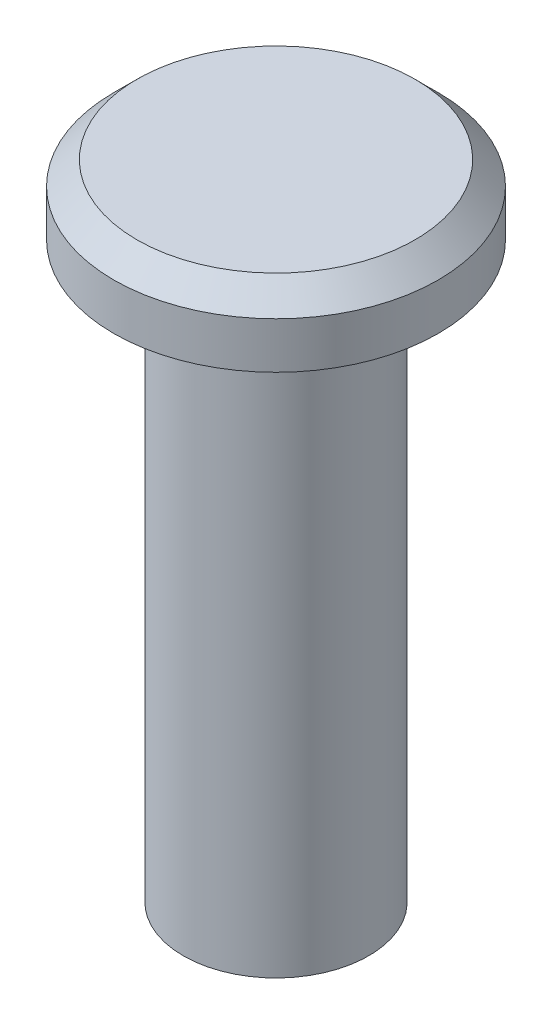
ISO-10303-21;
HEADER;
FILE_DESCRIPTION(('STEP AP214'),'2;1');
FILE_NAME('part.step','',(''),(''),'','','');
FILE_SCHEMA(('AUTOMOTIVE_DESIGN { 1 0 10303 214 1 1 1 1 }'));
ENDSEC;
DATA;
#1=APPLICATION_CONTEXT('core data for automotive mechanical design processes');
#2=APPLICATION_PROTOCOL_DEFINITION('international standard','automotive_design',2000,#1);
#3=PRODUCT_CONTEXT('',#1,'mechanical');
#4=PRODUCT('Part','Part','',(#3));
#5=PRODUCT_RELATED_PRODUCT_CATEGORY('part','',(#4));
#6=PRODUCT_DEFINITION_FORMATION('','',#4);
#7=PRODUCT_DEFINITION_CONTEXT('part definition',#1,'design');
#8=PRODUCT_DEFINITION('design','',#6,#7);
#9=PRODUCT_DEFINITION_SHAPE('','',#8);
#10=(LENGTH_UNIT() NAMED_UNIT(*) SI_UNIT(.MILLI.,.METRE.));
#11=(NAMED_UNIT(*) PLANE_ANGLE_UNIT() SI_UNIT($,.RADIAN.));
#12=(NAMED_UNIT(*) SI_UNIT($,.STERADIAN.) SOLID_ANGLE_UNIT());
#13=UNCERTAINTY_MEASURE_WITH_UNIT(LENGTH_MEASURE(1.E-05),#10,'distance_accuracy_value','');
#14=(GEOMETRIC_REPRESENTATION_CONTEXT(3) GLOBAL_UNCERTAINTY_ASSIGNED_CONTEXT((#13)) GLOBAL_UNIT_ASSIGNED_CONTEXT((#10,
#11,#12)) REPRESENTATION_CONTEXT('',''));
#15=CARTESIAN_POINT('',(0.,0.,0.));
#16=DIRECTION('',(0.,0.,1.));
#17=DIRECTION('',(1.,0.,0.));
#18=AXIS2_PLACEMENT_3D('',#15,#16,#17);
#19=CARTESIAN_POINT('',(0.,3.,0.));
#20=DIRECTION('',(0.,-1.,0.));
#21=DIRECTION('',(0.,0.,-1.));
#22=AXIS2_PLACEMENT_3D('',#19,#20,#21);
#23=CYLINDRICAL_SURFACE('',#22,7.);
#24=CARTESIAN_POINT('',(0.,1.99999999999999,0.));
#25=DIRECTION('',(0.,1.,0.));
#26=DIRECTION('',(0.,0.,1.));
#27=AXIS2_PLACEMENT_3D('',#24,#25,#26);
#28=CIRCLE('',#27,7.);
#29=CARTESIAN_POINT('',(0.,1.99999999999999,7.));
#30=VERTEX_POINT('',#29);
#31=EDGE_CURVE('E10',#30,#30,#28,.F.);
#32=ORIENTED_EDGE('',*,*,#31,.T.);
#33=EDGE_LOOP('',(#32));
#34=FACE_BOUND('',#33,.T.);
#35=CARTESIAN_POINT('',(0.,0.,0.));
#36=DIRECTION('',(0.,1.,0.));
#37=DIRECTION('',(0.,0.,1.));
#38=AXIS2_PLACEMENT_3D('',#35,#36,#37);
#39=CIRCLE('',#38,7.);
#40=CARTESIAN_POINT('',(0.,0.,7.));
#41=VERTEX_POINT('',#40);
#42=EDGE_CURVE('E64',#41,#41,#39,.T.);
#43=ORIENTED_EDGE('',*,*,#42,.T.);
#44=EDGE_LOOP('',(#43));
#45=FACE_BOUND('',#44,.T.);
#46=ADVANCED_FACE('F45',(#34,#45),#23,.T.);
#47=CARTESIAN_POINT('',(0.,3.,0.));
#48=DIRECTION('',(0.,1.,0.));
#49=DIRECTION('',(0.,0.,1.));
#50=AXIS2_PLACEMENT_3D('',#47,#48,#49);
#51=PLANE('',#50);
#52=CARTESIAN_POINT('',(0.,3.,0.));
#53=DIRECTION('',(0.,1.,0.));
#54=DIRECTION('',(0.,0.,1.));
#55=AXIS2_PLACEMENT_3D('',#52,#53,#54);
#56=CIRCLE('',#55,6.);
#57=CARTESIAN_POINT('',(0.,3.,6.));
#58=VERTEX_POINT('',#57);
#59=EDGE_CURVE('E54',#58,#58,#56,.T.);
#60=ORIENTED_EDGE('',*,*,#59,.T.);
#61=EDGE_LOOP('',(#60));
#62=FACE_BOUND('',#61,.T.);
#63=ADVANCED_FACE('F86',(#62),#51,.T.);
#64=CARTESIAN_POINT('',(0.,0.,0.));
#65=DIRECTION('',(0.,1.,0.));
#66=DIRECTION('',(0.,0.,1.));
#67=AXIS2_PLACEMENT_3D('',#64,#65,#66);
#68=PLANE('',#67);
#69=CARTESIAN_POINT('',(0.,0.,0.));
#70=DIRECTION('',(0.,-1.,0.));
#71=DIRECTION('',(0.,0.,-1.));
#72=AXIS2_PLACEMENT_3D('',#69,#70,#71);
#73=CIRCLE('',#72,4.);
#74=CARTESIAN_POINT('',(0.,0.,-4.));
#75=VERTEX_POINT('',#74);
#76=EDGE_CURVE('E59',#75,#75,#73,.T.);
#77=ORIENTED_EDGE('',*,*,#76,.F.);
#78=EDGE_LOOP('',(#77));
#79=FACE_BOUND('',#78,.T.);
#80=ORIENTED_EDGE('',*,*,#42,.F.);
#81=EDGE_LOOP('',(#80));
#82=FACE_BOUND('',#81,.T.);
#83=ADVANCED_FACE('F80',(#79,#82),#68,.F.);
#84=CARTESIAN_POINT('',(0.,-24.75,0.));
#85=DIRECTION('',(0.,1.,0.));
#86=DIRECTION('',(0.,0.,1.));
#87=AXIS2_PLACEMENT_3D('',#84,#85,#86);
#88=CYLINDRICAL_SURFACE('',#87,4.);
#89=CARTESIAN_POINT('',(0.,-24.75,0.));
#90=DIRECTION('',(0.,-1.,0.));
#91=DIRECTION('',(0.,0.,-1.));
#92=AXIS2_PLACEMENT_3D('',#89,#90,#91);
#93=CIRCLE('',#92,4.);
#94=CARTESIAN_POINT('',(0.,-24.75,-4.));
#95=VERTEX_POINT('',#94);
#96=EDGE_CURVE('E69',#95,#95,#93,.T.);
#97=ORIENTED_EDGE('',*,*,#96,.F.);
#98=EDGE_LOOP('',(#97));
#99=FACE_BOUND('',#98,.T.);
#100=ORIENTED_EDGE('',*,*,#76,.T.);
#101=EDGE_LOOP('',(#100));
#102=FACE_BOUND('',#101,.T.);
#103=ADVANCED_FACE('F77',(#99,#102),#88,.T.);
#104=CARTESIAN_POINT('',(0.,-24.75,0.));
#105=DIRECTION('',(0.,-1.,0.));
#106=DIRECTION('',(0.,0.,-1.));
#107=AXIS2_PLACEMENT_3D('',#104,#105,#106);
#108=PLANE('',#107);
#109=ORIENTED_EDGE('',*,*,#96,.T.);
#110=EDGE_LOOP('',(#109));
#111=FACE_BOUND('',#110,.T.);
#112=ADVANCED_FACE('F75',(#111),#108,.T.);
#113=CARTESIAN_POINT('',(0.,3.,0.));
#114=DIRECTION('',(0.,-1.,0.));
#115=DIRECTION('',(0.,0.,-1.));
#116=AXIS2_PLACEMENT_3D('',#113,#114,#115);
#117=CONICAL_SURFACE('',#116,6.,0.785398163397445);
#118=ORIENTED_EDGE('',*,*,#31,.F.);
#119=EDGE_LOOP('',(#118));
#120=FACE_BOUND('',#119,.T.);
#121=ORIENTED_EDGE('',*,*,#59,.F.);
#122=EDGE_LOOP('',(#121));
#123=FACE_BOUND('',#122,.T.);
#124=ADVANCED_FACE('F48',(#120,#123),#117,.T.);
#125=CLOSED_SHELL('',(#46,#63,#83,#103,#112,#124));
#126=MANIFOLD_SOLID_BREP('B2',#125);
#127=ADVANCED_BREP_SHAPE_REPRESENTATION('',(#18,#126),#14);
#128=SHAPE_DEFINITION_REPRESENTATION(#9,#127);
ENDSEC;
END-ISO-10303-21;
